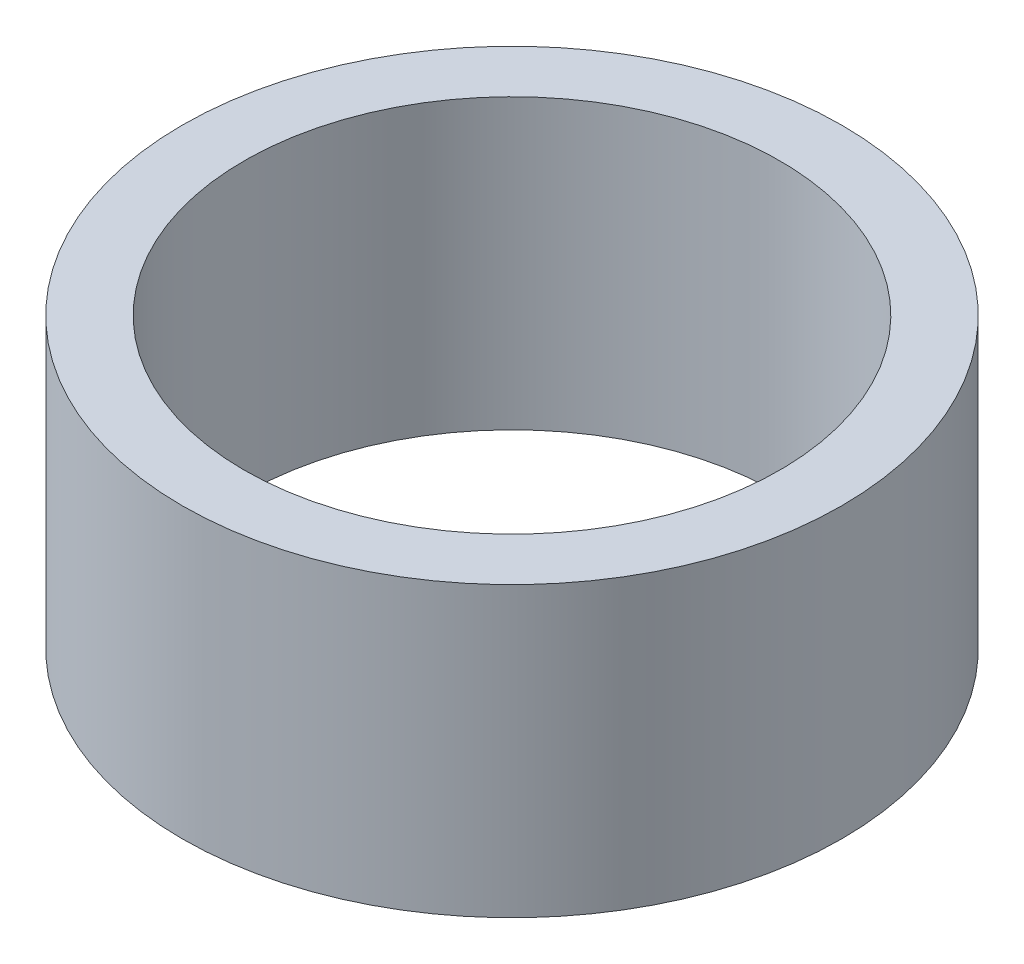
ISO-10303-21;
HEADER;
FILE_DESCRIPTION(('STEP AP214'),'2;1');
FILE_NAME('part.step','',(''),(''),'','','');
FILE_SCHEMA(('AUTOMOTIVE_DESIGN { 1 0 10303 214 1 1 1 1 }'));
ENDSEC;
DATA;
#1=APPLICATION_CONTEXT('core data for automotive mechanical design processes');
#2=APPLICATION_PROTOCOL_DEFINITION('international standard','automotive_design',2000,#1);
#3=PRODUCT_CONTEXT('',#1,'mechanical');
#4=PRODUCT('Part','Part','',(#3));
#5=PRODUCT_RELATED_PRODUCT_CATEGORY('part','',(#4));
#6=PRODUCT_DEFINITION_FORMATION('','',#4);
#7=PRODUCT_DEFINITION_CONTEXT('part definition',#1,'design');
#8=PRODUCT_DEFINITION('design','',#6,#7);
#9=PRODUCT_DEFINITION_SHAPE('','',#8);
#10=(LENGTH_UNIT() NAMED_UNIT(*) SI_UNIT(.MILLI.,.METRE.));
#11=(NAMED_UNIT(*) PLANE_ANGLE_UNIT() SI_UNIT($,.RADIAN.));
#12=(NAMED_UNIT(*) SI_UNIT($,.STERADIAN.) SOLID_ANGLE_UNIT());
#13=UNCERTAINTY_MEASURE_WITH_UNIT(LENGTH_MEASURE(1.E-05),#10,'distance_accuracy_value','');
#14=(GEOMETRIC_REPRESENTATION_CONTEXT(3) GLOBAL_UNCERTAINTY_ASSIGNED_CONTEXT((#13)) GLOBAL_UNIT_ASSIGNED_CONTEXT((#10,
#11,#12)) REPRESENTATION_CONTEXT('',''));
#15=CARTESIAN_POINT('',(0.,0.,0.));
#16=DIRECTION('',(0.,0.,1.));
#17=DIRECTION('',(1.,0.,0.));
#18=AXIS2_PLACEMENT_3D('',#15,#16,#17);
#19=CARTESIAN_POINT('',(0.,14.,0.));
#20=DIRECTION('',(0.,1.,0.));
#21=DIRECTION('',(0.,0.,1.));
#22=AXIS2_PLACEMENT_3D('',#19,#20,#21);
#23=PLANE('',#22);
#24=CARTESIAN_POINT('',(0.,14.,0.));
#25=DIRECTION('',(0.,1.,0.));
#26=DIRECTION('',(1.,0.,0.));
#27=AXIS2_PLACEMENT_3D('',#24,#25,#26);
#28=CIRCLE('',#27,16.);
#29=CARTESIAN_POINT('',(16.,14.,0.));
#30=VERTEX_POINT('',#29);
#31=EDGE_CURVE('E11',#30,#30,#28,.T.);
#32=ORIENTED_EDGE('',*,*,#31,.T.);
#33=EDGE_LOOP('',(#32));
#34=FACE_BOUND('',#33,.T.);
#35=CARTESIAN_POINT('',(0.,14.,0.));
#36=DIRECTION('',(0.,1.,0.));
#37=DIRECTION('',(0.,0.,1.));
#38=AXIS2_PLACEMENT_3D('',#35,#36,#37);
#39=CIRCLE('',#38,13.);
#40=CARTESIAN_POINT('',(0.,14.,13.));
#41=VERTEX_POINT('',#40);
#42=EDGE_CURVE('E54',#41,#41,#39,.T.);
#43=ORIENTED_EDGE('',*,*,#42,.F.);
#44=EDGE_LOOP('',(#43));
#45=FACE_BOUND('',#44,.T.);
#46=ADVANCED_FACE('F43',(#34,#45),#23,.T.);
#47=CARTESIAN_POINT('',(0.,0.,0.));
#48=DIRECTION('',(0.,1.,0.));
#49=DIRECTION('',(0.,0.,1.));
#50=AXIS2_PLACEMENT_3D('',#47,#48,#49);
#51=PLANE('',#50);
#52=CARTESIAN_POINT('',(0.,0.,0.));
#53=DIRECTION('',(0.,1.,0.));
#54=DIRECTION('',(1.,0.,0.));
#55=AXIS2_PLACEMENT_3D('',#52,#53,#54);
#56=CIRCLE('',#55,16.);
#57=CARTESIAN_POINT('',(16.,0.,0.));
#58=VERTEX_POINT('',#57);
#59=EDGE_CURVE('E47',#58,#58,#56,.T.);
#60=ORIENTED_EDGE('',*,*,#59,.F.);
#61=EDGE_LOOP('',(#60));
#62=FACE_BOUND('',#61,.T.);
#63=CARTESIAN_POINT('',(0.,0.,0.));
#64=DIRECTION('',(0.,1.,0.));
#65=DIRECTION('',(0.,0.,1.));
#66=AXIS2_PLACEMENT_3D('',#63,#64,#65);
#67=CIRCLE('',#66,13.);
#68=CARTESIAN_POINT('',(0.,0.,13.));
#69=VERTEX_POINT('',#68);
#70=EDGE_CURVE('E56',#69,#69,#67,.T.);
#71=ORIENTED_EDGE('',*,*,#70,.T.);
#72=EDGE_LOOP('',(#71));
#73=FACE_BOUND('',#72,.T.);
#74=ADVANCED_FACE('F66',(#62,#73),#51,.F.);
#75=CARTESIAN_POINT('',(0.,14.,0.));
#76=DIRECTION('',(0.,-1.,0.));
#77=DIRECTION('',(0.,0.,-1.));
#78=AXIS2_PLACEMENT_3D('',#75,#76,#77);
#79=CYLINDRICAL_SURFACE('',#78,16.);
#80=ORIENTED_EDGE('',*,*,#31,.F.);
#81=EDGE_LOOP('',(#80));
#82=FACE_BOUND('',#81,.T.);
#83=ORIENTED_EDGE('',*,*,#59,.T.);
#84=EDGE_LOOP('',(#83));
#85=FACE_BOUND('',#84,.T.);
#86=ADVANCED_FACE('F45',(#82,#85),#79,.T.);
#87=CARTESIAN_POINT('',(0.,14.,0.));
#88=DIRECTION('',(0.,-1.,0.));
#89=DIRECTION('',(0.,0.,-1.));
#90=AXIS2_PLACEMENT_3D('',#87,#88,#89);
#91=CYLINDRICAL_SURFACE('',#90,13.);
#92=ORIENTED_EDGE('',*,*,#42,.T.);
#93=EDGE_LOOP('',(#92));
#94=FACE_BOUND('',#93,.T.);
#95=ORIENTED_EDGE('',*,*,#70,.F.);
#96=EDGE_LOOP('',(#95));
#97=FACE_BOUND('',#96,.T.);
#98=ADVANCED_FACE('F62',(#94,#97),#91,.F.);
#99=CLOSED_SHELL('',(#46,#74,#86,#98));
#100=MANIFOLD_SOLID_BREP('B2',#99);
#101=ADVANCED_BREP_SHAPE_REPRESENTATION('',(#18,#100),#14);
#102=SHAPE_DEFINITION_REPRESENTATION(#9,#101);
ENDSEC;
END-ISO-10303-21;
